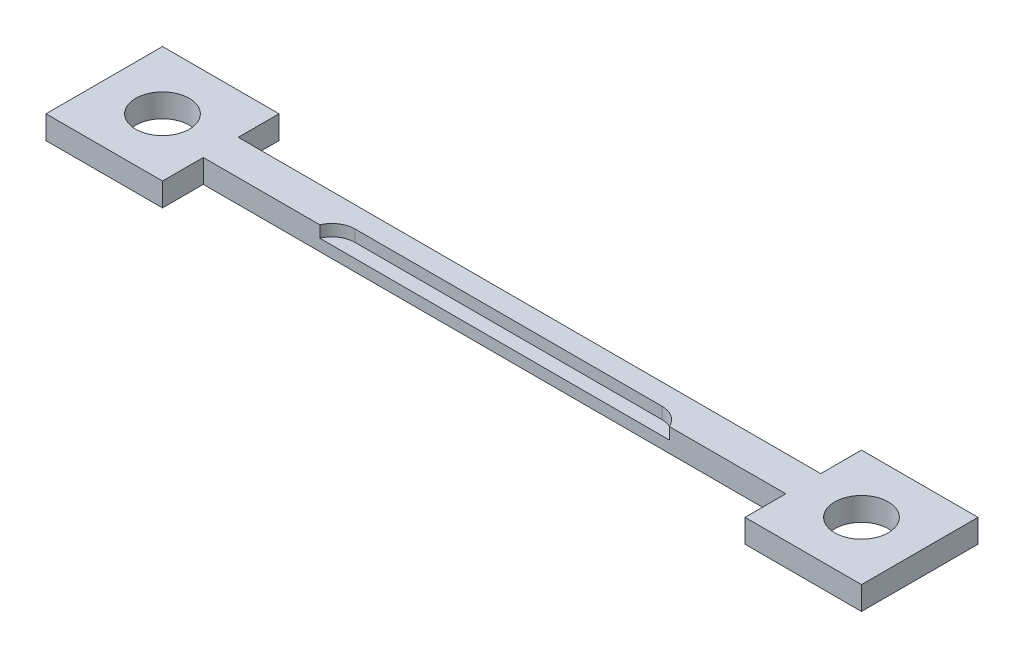
ISO-10303-21;
HEADER;
FILE_DESCRIPTION(('STEP AP214'),'2;1');
FILE_NAME('part.step','',(''),(''),'','','');
FILE_SCHEMA(('AUTOMOTIVE_DESIGN { 1 0 10303 214 1 1 1 1 }'));
ENDSEC;
DATA;
#1=APPLICATION_CONTEXT('core data for automotive mechanical design processes');
#2=APPLICATION_PROTOCOL_DEFINITION('international standard','automotive_design',2000,#1);
#3=PRODUCT_CONTEXT('',#1,'mechanical');
#4=PRODUCT('Part','Part','',(#3));
#5=PRODUCT_RELATED_PRODUCT_CATEGORY('part','',(#4));
#6=PRODUCT_DEFINITION_FORMATION('','',#4);
#7=PRODUCT_DEFINITION_CONTEXT('part definition',#1,'design');
#8=PRODUCT_DEFINITION('design','',#6,#7);
#9=PRODUCT_DEFINITION_SHAPE('','',#8);
#10=(LENGTH_UNIT() NAMED_UNIT(*) SI_UNIT(.MILLI.,.METRE.));
#11=(NAMED_UNIT(*) PLANE_ANGLE_UNIT() SI_UNIT($,.RADIAN.));
#12=(NAMED_UNIT(*) SI_UNIT($,.STERADIAN.) SOLID_ANGLE_UNIT());
#13=UNCERTAINTY_MEASURE_WITH_UNIT(LENGTH_MEASURE(1.E-05),#10,'distance_accuracy_value','');
#14=(GEOMETRIC_REPRESENTATION_CONTEXT(3) GLOBAL_UNCERTAINTY_ASSIGNED_CONTEXT((#13)) GLOBAL_UNIT_ASSIGNED_CONTEXT((#10,
#11,#12)) REPRESENTATION_CONTEXT('',''));
#15=CARTESIAN_POINT('',(0.,0.,0.));
#16=DIRECTION('',(0.,0.,1.));
#17=DIRECTION('',(1.,0.,0.));
#18=AXIS2_PLACEMENT_3D('',#15,#16,#17);
#19=CARTESIAN_POINT('',(-9.67404648456241,0.635,6.15575946530759));
#20=DIRECTION('',(0.,0.,1.));
#21=DIRECTION('',(1.,0.,0.));
#22=AXIS2_PLACEMENT_3D('',#19,#20,#21);
#23=PLANE('',#22);
#24=DIRECTION('',(-1.,0.,0.));
#25=VECTOR('',#24,1.);
#26=CARTESIAN_POINT('',(-9.67404648456241,-0.635,6.15575946530759));
#27=LINE('',#26,#25);
#28=CARTESIAN_POINT('',(-3.32404648456241,-0.635,6.15575946530759));
#29=VERTEX_POINT('',#28);
#30=CARTESIAN_POINT('',(-9.67404648456241,-0.635,6.15575946530759));
#31=VERTEX_POINT('',#30);
#32=EDGE_CURVE('E186',#29,#31,#27,.T.);
#33=ORIENTED_EDGE('',*,*,#32,.T.);
#34=DIRECTION('',(0.,-1.,0.));
#35=VECTOR('',#34,1.);
#36=CARTESIAN_POINT('',(-9.67404648456241,0.635,6.15575946530759));
#37=LINE('',#36,#35);
#38=CARTESIAN_POINT('',(-9.67404648456241,0.635,6.15575946530759));
#39=VERTEX_POINT('',#38);
#40=EDGE_CURVE('E270',#39,#31,#37,.T.);
#41=ORIENTED_EDGE('',*,*,#40,.F.);
#42=DIRECTION('',(-1.,0.,0.));
#43=VECTOR('',#42,1.);
#44=CARTESIAN_POINT('',(-9.67404648456241,0.635,6.15575946530759));
#45=LINE('',#44,#43);
#46=CARTESIAN_POINT('',(-3.32404648456241,0.635,6.15575946530759));
#47=VERTEX_POINT('',#46);
#48=EDGE_CURVE('E187',#47,#39,#45,.T.);
#49=ORIENTED_EDGE('',*,*,#48,.F.);
#50=DIRECTION('',(0.,-1.,0.));
#51=VECTOR('',#50,1.);
#52=CARTESIAN_POINT('',(-3.32404648456241,0.635,6.15575946530759));
#53=LINE('',#52,#51);
#54=EDGE_CURVE('E214',#47,#29,#53,.T.);
#55=ORIENTED_EDGE('',*,*,#54,.T.);
#56=EDGE_LOOP('',(#33,#41,#49,#55));
#57=FACE_BOUND('',#56,.T.);
#58=ADVANCED_FACE('F37',(#57),#23,.F.);
#59=CARTESIAN_POINT('',(-9.67404648456241,0.635,8.37825946530759));
#60=DIRECTION('',(1.,0.,0.));
#61=DIRECTION('',(0.,0.,-1.));
#62=AXIS2_PLACEMENT_3D('',#59,#60,#61);
#63=PLANE('',#62);
#64=DIRECTION('',(0.,0.,1.));
#65=VECTOR('',#64,1.);
#66=CARTESIAN_POINT('',(-9.67404648456241,-0.635,8.37825946530759));
#67=LINE('',#66,#65);
#68=CARTESIAN_POINT('',(-9.67404648456241,-0.635,8.37825946530759));
#69=VERTEX_POINT('',#68);
#70=EDGE_CURVE('E217',#31,#69,#67,.T.);
#71=ORIENTED_EDGE('',*,*,#70,.T.);
#72=DIRECTION('',(0.,-1.,0.));
#73=VECTOR('',#72,1.);
#74=CARTESIAN_POINT('',(-9.67404648456241,0.635,8.37825946530759));
#75=LINE('',#74,#73);
#76=CARTESIAN_POINT('',(-9.67404648456241,0.635,8.37825946530759));
#77=VERTEX_POINT('',#76);
#78=EDGE_CURVE('E267',#77,#69,#75,.T.);
#79=ORIENTED_EDGE('',*,*,#78,.F.);
#80=DIRECTION('',(0.,0.,1.));
#81=VECTOR('',#80,1.);
#82=CARTESIAN_POINT('',(-9.67404648456241,0.635,8.37825946530759));
#83=LINE('',#82,#81);
#84=EDGE_CURVE('E190',#39,#77,#83,.T.);
#85=ORIENTED_EDGE('',*,*,#84,.F.);
#86=ORIENTED_EDGE('',*,*,#40,.T.);
#87=EDGE_LOOP('',(#71,#79,#85,#86));
#88=FACE_BOUND('',#87,.T.);
#89=ADVANCED_FACE('F312',(#88),#63,.F.);
#90=CARTESIAN_POINT('',(-41.4240464845624,0.635,8.37825946530759));
#91=DIRECTION('',(0.,0.,1.));
#92=DIRECTION('',(1.,0.,0.));
#93=AXIS2_PLACEMENT_3D('',#90,#91,#92);
#94=PLANE('',#93);
#95=DIRECTION('',(-1.,0.,0.));
#96=VECTOR('',#95,1.);
#97=CARTESIAN_POINT('',(-41.4240464845624,-0.635,8.37825946530759));
#98=LINE('',#97,#96);
#99=CARTESIAN_POINT('',(-41.4240464845624,-0.635,8.37825946530759));
#100=VERTEX_POINT('',#99);
#101=EDGE_CURVE('E219',#69,#100,#98,.T.);
#102=ORIENTED_EDGE('',*,*,#101,.T.);
#103=DIRECTION('',(0.,-1.,0.));
#104=VECTOR('',#103,1.);
#105=CARTESIAN_POINT('',(-41.4240464845624,0.635,8.37825946530759));
#106=LINE('',#105,#104);
#107=CARTESIAN_POINT('',(-41.4240464845624,0.635,8.37825946530759));
#108=VERTEX_POINT('',#107);
#109=EDGE_CURVE('E264',#108,#100,#106,.T.);
#110=ORIENTED_EDGE('',*,*,#109,.F.);
#111=DIRECTION('',(-1.,0.,0.));
#112=VECTOR('',#111,1.);
#113=CARTESIAN_POINT('',(-41.4240464845624,0.635,8.37825946530759));
#114=LINE('',#113,#112);
#115=EDGE_CURVE('E193',#77,#108,#114,.T.);
#116=ORIENTED_EDGE('',*,*,#115,.F.);
#117=ORIENTED_EDGE('',*,*,#78,.T.);
#118=EDGE_LOOP('',(#102,#110,#116,#117));
#119=FACE_BOUND('',#118,.T.);
#120=ADVANCED_FACE('F318',(#119),#94,.F.);
#121=CARTESIAN_POINT('',(-41.4240464845624,0.635,8.37825946530759));
#122=DIRECTION('',(-1.,0.,0.));
#123=DIRECTION('',(0.,0.,1.));
#124=AXIS2_PLACEMENT_3D('',#121,#122,#123);
#125=PLANE('',#124);
#126=DIRECTION('',(0.,0.,-1.));
#127=VECTOR('',#126,1.);
#128=CARTESIAN_POINT('',(-41.4240464845624,-0.635,8.37825946530759));
#129=LINE('',#128,#127);
#130=CARTESIAN_POINT('',(-41.4240464845624,-0.635,6.15575946530758));
#131=VERTEX_POINT('',#130);
#132=EDGE_CURVE('E221',#100,#131,#129,.T.);
#133=ORIENTED_EDGE('',*,*,#132,.T.);
#134=DIRECTION('',(0.,-1.,0.));
#135=VECTOR('',#134,1.);
#136=CARTESIAN_POINT('',(-41.4240464845624,0.635,6.15575946530758));
#137=LINE('',#136,#135);
#138=CARTESIAN_POINT('',(-41.4240464845624,0.635,6.15575946530758));
#139=VERTEX_POINT('',#138);
#140=EDGE_CURVE('E261',#139,#131,#137,.T.);
#141=ORIENTED_EDGE('',*,*,#140,.F.);
#142=DIRECTION('',(0.,0.,-1.));
#143=VECTOR('',#142,1.);
#144=CARTESIAN_POINT('',(-41.4240464845624,0.635,8.37825946530759));
#145=LINE('',#144,#143);
#146=EDGE_CURVE('E195',#108,#139,#145,.T.);
#147=ORIENTED_EDGE('',*,*,#146,.F.);
#148=ORIENTED_EDGE('',*,*,#109,.T.);
#149=EDGE_LOOP('',(#133,#141,#147,#148));
#150=FACE_BOUND('',#149,.T.);
#151=ADVANCED_FACE('F324',(#150),#125,.F.);
#152=CARTESIAN_POINT('',(-47.7740464845624,0.635,6.15575946530758));
#153=DIRECTION('',(0.,0.,1.));
#154=DIRECTION('',(1.,0.,0.));
#155=AXIS2_PLACEMENT_3D('',#152,#153,#154);
#156=PLANE('',#155);
#157=DIRECTION('',(-1.,0.,0.));
#158=VECTOR('',#157,1.);
#159=CARTESIAN_POINT('',(-47.7740464845624,-0.635,6.15575946530758));
#160=LINE('',#159,#158);
#161=CARTESIAN_POINT('',(-47.7740464845624,-0.635,6.15575946530758));
#162=VERTEX_POINT('',#161);
#163=EDGE_CURVE('E223',#131,#162,#160,.T.);
#164=ORIENTED_EDGE('',*,*,#163,.T.);
#165=DIRECTION('',(0.,-1.,0.));
#166=VECTOR('',#165,1.);
#167=CARTESIAN_POINT('',(-47.7740464845624,0.635,6.15575946530758));
#168=LINE('',#167,#166);
#169=CARTESIAN_POINT('',(-47.7740464845624,0.635,6.15575946530758));
#170=VERTEX_POINT('',#169);
#171=EDGE_CURVE('E258',#170,#162,#168,.T.);
#172=ORIENTED_EDGE('',*,*,#171,.F.);
#173=DIRECTION('',(-1.,0.,0.));
#174=VECTOR('',#173,1.);
#175=CARTESIAN_POINT('',(-47.7740464845624,0.635,6.15575946530758));
#176=LINE('',#175,#174);
#177=EDGE_CURVE('E197',#139,#170,#176,.T.);
#178=ORIENTED_EDGE('',*,*,#177,.F.);
#179=ORIENTED_EDGE('',*,*,#140,.T.);
#180=EDGE_LOOP('',(#164,#172,#178,#179));
#181=FACE_BOUND('',#180,.T.);
#182=ADVANCED_FACE('F328',(#181),#156,.F.);
#183=CARTESIAN_POINT('',(-47.7740464845624,0.635,12.5057594653076));
#184=DIRECTION('',(1.,0.,0.));
#185=DIRECTION('',(0.,0.,-1.));
#186=AXIS2_PLACEMENT_3D('',#183,#184,#185);
#187=PLANE('',#186);
#188=DIRECTION('',(0.,0.,1.));
#189=VECTOR('',#188,1.);
#190=CARTESIAN_POINT('',(-47.7740464845624,-0.635,12.5057594653076));
#191=LINE('',#190,#189);
#192=CARTESIAN_POINT('',(-47.7740464845624,-0.635,12.5057594653076));
#193=VERTEX_POINT('',#192);
#194=EDGE_CURVE('E225',#162,#193,#191,.T.);
#195=ORIENTED_EDGE('',*,*,#194,.T.);
#196=DIRECTION('',(0.,-1.,0.));
#197=VECTOR('',#196,1.);
#198=CARTESIAN_POINT('',(-47.7740464845624,0.635,12.5057594653076));
#199=LINE('',#198,#197);
#200=CARTESIAN_POINT('',(-47.7740464845624,0.635,12.5057594653076));
#201=VERTEX_POINT('',#200);
#202=EDGE_CURVE('E255',#201,#193,#199,.T.);
#203=ORIENTED_EDGE('',*,*,#202,.F.);
#204=DIRECTION('',(0.,0.,1.));
#205=VECTOR('',#204,1.);
#206=CARTESIAN_POINT('',(-47.7740464845624,0.635,12.5057594653076));
#207=LINE('',#206,#205);
#208=EDGE_CURVE('E199',#170,#201,#207,.T.);
#209=ORIENTED_EDGE('',*,*,#208,.F.);
#210=ORIENTED_EDGE('',*,*,#171,.T.);
#211=EDGE_LOOP('',(#195,#203,#209,#210));
#212=FACE_BOUND('',#211,.T.);
#213=ADVANCED_FACE('F332',(#212),#187,.F.);
#214=CARTESIAN_POINT('',(-47.7740464845624,0.635,12.5057594653076));
#215=DIRECTION('',(0.,0.,-1.));
#216=DIRECTION('',(-1.,0.,0.));
#217=AXIS2_PLACEMENT_3D('',#214,#215,#216);
#218=PLANE('',#217);
#219=DIRECTION('',(1.,0.,0.));
#220=VECTOR('',#219,1.);
#221=CARTESIAN_POINT('',(-47.7740464845624,-0.635,12.5057594653076));
#222=LINE('',#221,#220);
#223=CARTESIAN_POINT('',(-41.4240464845624,-0.635,12.5057594653076));
#224=VERTEX_POINT('',#223);
#225=EDGE_CURVE('E227',#193,#224,#222,.T.);
#226=ORIENTED_EDGE('',*,*,#225,.T.);
#227=DIRECTION('',(0.,-1.,0.));
#228=VECTOR('',#227,1.);
#229=CARTESIAN_POINT('',(-41.4240464845624,0.635,12.5057594653076));
#230=LINE('',#229,#228);
#231=CARTESIAN_POINT('',(-41.4240464845624,0.635,12.5057594653076));
#232=VERTEX_POINT('',#231);
#233=EDGE_CURVE('E252',#232,#224,#230,.T.);
#234=ORIENTED_EDGE('',*,*,#233,.F.);
#235=DIRECTION('',(1.,0.,0.));
#236=VECTOR('',#235,1.);
#237=CARTESIAN_POINT('',(-47.7740464845624,0.635,12.5057594653076));
#238=LINE('',#237,#236);
#239=EDGE_CURVE('E201',#201,#232,#238,.T.);
#240=ORIENTED_EDGE('',*,*,#239,.F.);
#241=ORIENTED_EDGE('',*,*,#202,.T.);
#242=EDGE_LOOP('',(#226,#234,#240,#241));
#243=FACE_BOUND('',#242,.T.);
#244=ADVANCED_FACE('F336',(#243),#218,.F.);
#245=CARTESIAN_POINT('',(-41.4240464845624,0.635,10.2832594653076));
#246=DIRECTION('',(-1.,0.,0.));
#247=DIRECTION('',(0.,0.,1.));
#248=AXIS2_PLACEMENT_3D('',#245,#246,#247);
#249=PLANE('',#248);
#250=DIRECTION('',(0.,0.,-1.));
#251=VECTOR('',#250,1.);
#252=CARTESIAN_POINT('',(-41.4240464845624,-0.635,10.2832594653076));
#253=LINE('',#252,#251);
#254=CARTESIAN_POINT('',(-41.4240464845624,-0.635,10.2832594653076));
#255=VERTEX_POINT('',#254);
#256=EDGE_CURVE('E229',#224,#255,#253,.T.);
#257=ORIENTED_EDGE('',*,*,#256,.T.);
#258=DIRECTION('',(0.,-1.,0.));
#259=VECTOR('',#258,1.);
#260=CARTESIAN_POINT('',(-41.4240464845624,0.635,10.2832594653076));
#261=LINE('',#260,#259);
#262=CARTESIAN_POINT('',(-41.4240464845624,0.635,10.2832594653076));
#263=VERTEX_POINT('',#262);
#264=EDGE_CURVE('E249',#263,#255,#261,.T.);
#265=ORIENTED_EDGE('',*,*,#264,.F.);
#266=DIRECTION('',(0.,0.,-1.));
#267=VECTOR('',#266,1.);
#268=CARTESIAN_POINT('',(-41.4240464845624,0.635,10.2832594653076));
#269=LINE('',#268,#267);
#270=EDGE_CURVE('E203',#232,#263,#269,.T.);
#271=ORIENTED_EDGE('',*,*,#270,.F.);
#272=ORIENTED_EDGE('',*,*,#233,.T.);
#273=EDGE_LOOP('',(#257,#265,#271,#272));
#274=FACE_BOUND('',#273,.T.);
#275=ADVANCED_FACE('F340',(#274),#249,.F.);
#276=CARTESIAN_POINT('',(-41.4240464845624,0.635,10.2832594653076));
#277=DIRECTION('',(0.,0.,-1.));
#278=DIRECTION('',(-1.,0.,0.));
#279=AXIS2_PLACEMENT_3D('',#276,#277,#278);
#280=PLANE('',#279);
#281=DIRECTION('',(1.,0.,0.));
#282=VECTOR('',#281,1.);
#283=CARTESIAN_POINT('',(-41.4240464845624,0.635,10.2832594653076));
#284=LINE('',#283,#282);
#285=CARTESIAN_POINT('',(-16.0240464845624,0.635,10.2832594653076));
#286=VERTEX_POINT('',#285);
#287=CARTESIAN_POINT('',(-9.67404648456241,0.635,10.2832594653076));
#288=VERTEX_POINT('',#287);
#289=EDGE_CURVE('E205',#286,#288,#284,.T.);
#290=ORIENTED_EDGE('',*,*,#289,.F.);
#291=DIRECTION('',(0.,1.,0.));
#292=VECTOR('',#291,1.);
#293=CARTESIAN_POINT('',(-16.0240464845624,0.,10.2832594653076));
#294=LINE('',#293,#292);
#295=CARTESIAN_POINT('',(-16.0240464845624,0.,10.2832594653076));
#296=VERTEX_POINT('',#295);
#297=EDGE_CURVE('E166',#296,#286,#294,.T.);
#298=ORIENTED_EDGE('',*,*,#297,.F.);
#299=DIRECTION('',(1.,0.,0.));
#300=VECTOR('',#299,1.);
#301=CARTESIAN_POINT('',(-35.0740464845624,0.,10.2832594653076));
#302=LINE('',#301,#300);
#303=CARTESIAN_POINT('',(-35.0740464845624,0.,10.2832594653076));
#304=VERTEX_POINT('',#303);
#305=EDGE_CURVE('E149',#304,#296,#302,.T.);
#306=ORIENTED_EDGE('',*,*,#305,.F.);
#307=DIRECTION('',(0.,1.,0.));
#308=VECTOR('',#307,1.);
#309=CARTESIAN_POINT('',(-35.0740464845624,0.,10.2832594653076));
#310=LINE('',#309,#308);
#311=CARTESIAN_POINT('',(-35.0740464845624,0.635,10.2832594653076));
#312=VERTEX_POINT('',#311);
#313=EDGE_CURVE('E164',#304,#312,#310,.T.);
#314=ORIENTED_EDGE('',*,*,#313,.T.);
#315=EDGE_CURVE('E206',#263,#312,#284,.T.);
#316=ORIENTED_EDGE('',*,*,#315,.F.);
#317=ORIENTED_EDGE('',*,*,#264,.T.);
#318=DIRECTION('',(1.,0.,0.));
#319=VECTOR('',#318,1.);
#320=CARTESIAN_POINT('',(-41.4240464845624,-0.635,10.2832594653076));
#321=LINE('',#320,#319);
#322=CARTESIAN_POINT('',(-9.67404648456241,-0.635,10.2832594653076));
#323=VERTEX_POINT('',#322);
#324=EDGE_CURVE('E231',#255,#323,#321,.T.);
#325=ORIENTED_EDGE('',*,*,#324,.T.);
#326=DIRECTION('',(0.,-1.,0.));
#327=VECTOR('',#326,1.);
#328=CARTESIAN_POINT('',(-9.67404648456241,0.635,10.2832594653076));
#329=LINE('',#328,#327);
#330=EDGE_CURVE('E246',#288,#323,#329,.T.);
#331=ORIENTED_EDGE('',*,*,#330,.F.);
#332=EDGE_LOOP('',(#290,#298,#306,#314,#316,#317,#325,#331));
#333=FACE_BOUND('',#332,.T.);
#334=ADVANCED_FACE('F162',(#333),#280,.F.);
#335=CARTESIAN_POINT('',(-9.67404648456241,0.635,10.2832594653076));
#336=DIRECTION('',(1.,0.,0.));
#337=DIRECTION('',(0.,0.,-1.));
#338=AXIS2_PLACEMENT_3D('',#335,#336,#337);
#339=PLANE('',#338);
#340=DIRECTION('',(0.,0.,1.));
#341=VECTOR('',#340,1.);
#342=CARTESIAN_POINT('',(-9.67404648456241,-0.635,10.2832594653076));
#343=LINE('',#342,#341);
#344=CARTESIAN_POINT('',(-9.67404648456241,-0.635,12.5057594653076));
#345=VERTEX_POINT('',#344);
#346=EDGE_CURVE('E233',#323,#345,#343,.T.);
#347=ORIENTED_EDGE('',*,*,#346,.T.);
#348=DIRECTION('',(0.,-1.,0.));
#349=VECTOR('',#348,1.);
#350=CARTESIAN_POINT('',(-9.67404648456241,0.635,12.5057594653076));
#351=LINE('',#350,#349);
#352=CARTESIAN_POINT('',(-9.67404648456241,0.635,12.5057594653076));
#353=VERTEX_POINT('',#352);
#354=EDGE_CURVE('E243',#353,#345,#351,.T.);
#355=ORIENTED_EDGE('',*,*,#354,.F.);
#356=DIRECTION('',(0.,0.,1.));
#357=VECTOR('',#356,1.);
#358=CARTESIAN_POINT('',(-9.67404648456241,0.635,10.2832594653076));
#359=LINE('',#358,#357);
#360=EDGE_CURVE('E208',#288,#353,#359,.T.);
#361=ORIENTED_EDGE('',*,*,#360,.F.);
#362=ORIENTED_EDGE('',*,*,#330,.T.);
#363=EDGE_LOOP('',(#347,#355,#361,#362));
#364=FACE_BOUND('',#363,.T.);
#365=ADVANCED_FACE('F299',(#364),#339,.F.);
#366=CARTESIAN_POINT('',(-9.67404648456241,0.635,12.5057594653076));
#367=DIRECTION('',(0.,0.,-1.));
#368=DIRECTION('',(-1.,0.,0.));
#369=AXIS2_PLACEMENT_3D('',#366,#367,#368);
#370=PLANE('',#369);
#371=DIRECTION('',(1.,0.,0.));
#372=VECTOR('',#371,1.);
#373=CARTESIAN_POINT('',(-9.67404648456241,-0.635,12.5057594653076));
#374=LINE('',#373,#372);
#375=CARTESIAN_POINT('',(-3.32404648456241,-0.635,12.5057594653076));
#376=VERTEX_POINT('',#375);
#377=EDGE_CURVE('E235',#345,#376,#374,.T.);
#378=ORIENTED_EDGE('',*,*,#377,.T.);
#379=DIRECTION('',(0.,-1.,0.));
#380=VECTOR('',#379,1.);
#381=CARTESIAN_POINT('',(-3.32404648456241,0.635,12.5057594653076));
#382=LINE('',#381,#380);
#383=CARTESIAN_POINT('',(-3.32404648456241,0.635,12.5057594653076));
#384=VERTEX_POINT('',#383);
#385=EDGE_CURVE('E240',#384,#376,#382,.T.);
#386=ORIENTED_EDGE('',*,*,#385,.F.);
#387=DIRECTION('',(1.,0.,0.));
#388=VECTOR('',#387,1.);
#389=CARTESIAN_POINT('',(-9.67404648456241,0.635,12.5057594653076));
#390=LINE('',#389,#388);
#391=EDGE_CURVE('E210',#353,#384,#390,.T.);
#392=ORIENTED_EDGE('',*,*,#391,.F.);
#393=ORIENTED_EDGE('',*,*,#354,.T.);
#394=EDGE_LOOP('',(#378,#386,#392,#393));
#395=FACE_BOUND('',#394,.T.);
#396=ADVANCED_FACE('F303',(#395),#370,.F.);
#397=CARTESIAN_POINT('',(-3.32404648456241,0.635,12.5057594653076));
#398=DIRECTION('',(-1.,0.,0.));
#399=DIRECTION('',(0.,0.,1.));
#400=AXIS2_PLACEMENT_3D('',#397,#398,#399);
#401=PLANE('',#400);
#402=DIRECTION('',(0.,0.,-1.));
#403=VECTOR('',#402,1.);
#404=CARTESIAN_POINT('',(-3.32404648456241,-0.635,12.5057594653076));
#405=LINE('',#404,#403);
#406=EDGE_CURVE('E191',#376,#29,#405,.T.);
#407=ORIENTED_EDGE('',*,*,#406,.T.);
#408=ORIENTED_EDGE('',*,*,#54,.F.);
#409=DIRECTION('',(0.,0.,-1.));
#410=VECTOR('',#409,1.);
#411=CARTESIAN_POINT('',(-3.32404648456241,0.635,12.5057594653076));
#412=LINE('',#411,#410);
#413=EDGE_CURVE('E212',#384,#47,#412,.T.);
#414=ORIENTED_EDGE('',*,*,#413,.F.);
#415=ORIENTED_EDGE('',*,*,#385,.T.);
#416=EDGE_LOOP('',(#407,#408,#414,#415));
#417=FACE_BOUND('',#416,.T.);
#418=ADVANCED_FACE('F350',(#417),#401,.F.);
#419=CARTESIAN_POINT('',(-3.32404648456241,0.635,6.15575946530759));
#420=DIRECTION('',(0.,1.,0.));
#421=DIRECTION('',(0.,0.,1.));
#422=AXIS2_PLACEMENT_3D('',#419,#420,#421);
#423=PLANE('',#422);
#424=DIRECTION('',(-1.,0.,0.));
#425=VECTOR('',#424,1.);
#426=CARTESIAN_POINT('',(-35.0740464845624,0.635,9.52125946530759));
#427=LINE('',#426,#425);
#428=CARTESIAN_POINT('',(-17.1880207110812,0.635,9.52125946530759));
#429=VERTEX_POINT('',#428);
#430=CARTESIAN_POINT('',(-33.9100722580436,0.635,9.52125946530759));
#431=VERTEX_POINT('',#430);
#432=EDGE_CURVE('E279',#429,#431,#427,.T.);
#433=ORIENTED_EDGE('',*,*,#432,.F.);
#434=CARTESIAN_POINT('',(-17.1880207110812,0.635,10.7912594653076));
#435=DIRECTION('',(0.,1.,0.));
#436=DIRECTION('',(0.,0.,1.));
#437=AXIS2_PLACEMENT_3D('',#434,#435,#436);
#438=CIRCLE('',#437,1.27);
#439=EDGE_CURVE('E11',#429,#286,#438,.F.);
#440=ORIENTED_EDGE('',*,*,#439,.T.);
#441=ORIENTED_EDGE('',*,*,#289,.T.);
#442=ORIENTED_EDGE('',*,*,#360,.T.);
#443=ORIENTED_EDGE('',*,*,#391,.T.);
#444=ORIENTED_EDGE('',*,*,#413,.T.);
#445=ORIENTED_EDGE('',*,*,#48,.T.);
#446=ORIENTED_EDGE('',*,*,#84,.T.);
#447=ORIENTED_EDGE('',*,*,#115,.T.);
#448=ORIENTED_EDGE('',*,*,#146,.T.);
#449=ORIENTED_EDGE('',*,*,#177,.T.);
#450=ORIENTED_EDGE('',*,*,#208,.T.);
#451=ORIENTED_EDGE('',*,*,#239,.T.);
#452=ORIENTED_EDGE('',*,*,#270,.T.);
#453=ORIENTED_EDGE('',*,*,#315,.T.);
#454=CARTESIAN_POINT('',(-33.9100722580436,0.635,10.7912594653076));
#455=DIRECTION('',(0.,1.,0.));
#456=DIRECTION('',(0.,0.,1.));
#457=AXIS2_PLACEMENT_3D('',#454,#455,#456);
#458=CIRCLE('',#457,1.27);
#459=EDGE_CURVE('E156',#312,#431,#458,.F.);
#460=ORIENTED_EDGE('',*,*,#459,.T.);
#461=EDGE_LOOP('',(#433,#440,#441,#442,#443,#444,#445,#446,#447,#448,#449,#450,#451,#452,#453,#460));
#462=FACE_BOUND('',#461,.T.);
#463=CARTESIAN_POINT('',(-6.49904648456241,0.635,9.33075946530758));
#464=DIRECTION('',(0.,1.,0.));
#465=DIRECTION('',(0.,0.,1.));
#466=AXIS2_PLACEMENT_3D('',#463,#464,#465);
#467=CIRCLE('',#466,1.4605);
#468=CARTESIAN_POINT('',(-6.49904648456241,0.635,10.7912594653076));
#469=VERTEX_POINT('',#468);
#470=EDGE_CURVE('E171',#469,#469,#467,.T.);
#471=ORIENTED_EDGE('',*,*,#470,.F.);
#472=EDGE_LOOP('',(#471));
#473=FACE_BOUND('',#472,.T.);
#474=CARTESIAN_POINT('',(-44.5990464845624,0.635,9.33075946530758));
#475=DIRECTION('',(0.,1.,0.));
#476=DIRECTION('',(0.,0.,1.));
#477=AXIS2_PLACEMENT_3D('',#474,#475,#476);
#478=CIRCLE('',#477,1.4605);
#479=CARTESIAN_POINT('',(-44.5990464845624,0.635,10.7912594653076));
#480=VERTEX_POINT('',#479);
#481=EDGE_CURVE('E180',#480,#480,#478,.T.);
#482=ORIENTED_EDGE('',*,*,#481,.F.);
#483=EDGE_LOOP('',(#482));
#484=FACE_BOUND('',#483,.T.);
#485=ADVANCED_FACE('F281',(#462,#473,#484),#423,.T.);
#486=CARTESIAN_POINT('',(-3.32404648456241,-0.635,6.15575946530759));
#487=DIRECTION('',(0.,1.,0.));
#488=DIRECTION('',(0.,0.,1.));
#489=AXIS2_PLACEMENT_3D('',#486,#487,#488);
#490=PLANE('',#489);
#491=CARTESIAN_POINT('',(-6.49904648456241,-0.635,9.33075946530758));
#492=DIRECTION('',(0.,1.,0.));
#493=DIRECTION('',(0.,0.,1.));
#494=AXIS2_PLACEMENT_3D('',#491,#492,#493);
#495=CIRCLE('',#494,1.4605);
#496=CARTESIAN_POINT('',(-6.49904648456241,-0.635,10.7912594653076));
#497=VERTEX_POINT('',#496);
#498=EDGE_CURVE('E177',#497,#497,#495,.T.);
#499=ORIENTED_EDGE('',*,*,#498,.T.);
#500=EDGE_LOOP('',(#499));
#501=FACE_BOUND('',#500,.T.);
#502=CARTESIAN_POINT('',(-44.5990464845624,-0.635,9.33075946530758));
#503=DIRECTION('',(0.,1.,0.));
#504=DIRECTION('',(0.,0.,1.));
#505=AXIS2_PLACEMENT_3D('',#502,#503,#504);
#506=CIRCLE('',#505,1.4605);
#507=CARTESIAN_POINT('',(-44.5990464845624,-0.635,10.7912594653076));
#508=VERTEX_POINT('',#507);
#509=EDGE_CURVE('E183',#508,#508,#506,.T.);
#510=ORIENTED_EDGE('',*,*,#509,.T.);
#511=EDGE_LOOP('',(#510));
#512=FACE_BOUND('',#511,.T.);
#513=ORIENTED_EDGE('',*,*,#32,.F.);
#514=ORIENTED_EDGE('',*,*,#406,.F.);
#515=ORIENTED_EDGE('',*,*,#377,.F.);
#516=ORIENTED_EDGE('',*,*,#346,.F.);
#517=ORIENTED_EDGE('',*,*,#324,.F.);
#518=ORIENTED_EDGE('',*,*,#256,.F.);
#519=ORIENTED_EDGE('',*,*,#225,.F.);
#520=ORIENTED_EDGE('',*,*,#194,.F.);
#521=ORIENTED_EDGE('',*,*,#163,.F.);
#522=ORIENTED_EDGE('',*,*,#132,.F.);
#523=ORIENTED_EDGE('',*,*,#101,.F.);
#524=ORIENTED_EDGE('',*,*,#70,.F.);
#525=EDGE_LOOP('',(#513,#514,#515,#516,#517,#518,#519,#520,#521,#522,#523,#524));
#526=FACE_BOUND('',#525,.T.);
#527=ADVANCED_FACE('F293',(#501,#512,#526),#490,.F.);
#528=CARTESIAN_POINT('',(-44.5990464845624,0.635,9.33075946530758));
#529=DIRECTION('',(0.,1.,0.));
#530=DIRECTION('',(0.,0.,1.));
#531=AXIS2_PLACEMENT_3D('',#528,#529,#530);
#532=CYLINDRICAL_SURFACE('',#531,1.4605);
#533=ORIENTED_EDGE('',*,*,#509,.F.);
#534=EDGE_LOOP('',(#533));
#535=FACE_BOUND('',#534,.T.);
#536=ORIENTED_EDGE('',*,*,#481,.T.);
#537=EDGE_LOOP('',(#536));
#538=FACE_BOUND('',#537,.T.);
#539=ADVANCED_FACE('F356',(#535,#538),#532,.F.);
#540=CARTESIAN_POINT('',(-6.49904648456241,0.635,9.33075946530758));
#541=DIRECTION('',(0.,1.,0.));
#542=DIRECTION('',(0.,0.,1.));
#543=AXIS2_PLACEMENT_3D('',#540,#541,#542);
#544=CYLINDRICAL_SURFACE('',#543,1.4605);
#545=ORIENTED_EDGE('',*,*,#498,.F.);
#546=EDGE_LOOP('',(#545));
#547=FACE_BOUND('',#546,.T.);
#548=ORIENTED_EDGE('',*,*,#470,.T.);
#549=EDGE_LOOP('',(#548));
#550=FACE_BOUND('',#549,.T.);
#551=ADVANCED_FACE('F362',(#547,#550),#544,.F.);
#552=CARTESIAN_POINT('',(-35.0740464845624,0.,9.52125946530759));
#553=DIRECTION('',(0.,0.,-1.));
#554=DIRECTION('',(-1.,0.,0.));
#555=AXIS2_PLACEMENT_3D('',#552,#553,#554);
#556=PLANE('',#555);
#557=DIRECTION('',(-1.,0.,0.));
#558=VECTOR('',#557,1.);
#559=CARTESIAN_POINT('',(-35.0740464845624,0.,9.52125946530759));
#560=LINE('',#559,#558);
#561=CARTESIAN_POINT('',(-17.1880207110812,0.,9.52125946530759));
#562=VERTEX_POINT('',#561);
#563=CARTESIAN_POINT('',(-33.9100722580436,0.,9.52125946530759));
#564=VERTEX_POINT('',#563);
#565=EDGE_CURVE('E151',#562,#564,#560,.T.);
#566=ORIENTED_EDGE('',*,*,#565,.F.);
#567=DIRECTION('',(0.,1.,0.));
#568=VECTOR('',#567,1.);
#569=CARTESIAN_POINT('',(-17.1880207110812,0.,9.52125946530759));
#570=LINE('',#569,#568);
#571=EDGE_CURVE('E275',#562,#429,#570,.T.);
#572=ORIENTED_EDGE('',*,*,#571,.T.);
#573=ORIENTED_EDGE('',*,*,#432,.T.);
#574=DIRECTION('',(0.,-1.,0.));
#575=VECTOR('',#574,1.);
#576=CARTESIAN_POINT('',(-33.9100722580436,0.,9.52125946530759));
#577=LINE('',#576,#575);
#578=EDGE_CURVE('E157',#431,#564,#577,.T.);
#579=ORIENTED_EDGE('',*,*,#578,.T.);
#580=EDGE_LOOP('',(#566,#572,#573,#579));
#581=FACE_BOUND('',#580,.T.);
#582=ADVANCED_FACE('F278',(#581),#556,.F.);
#583=CARTESIAN_POINT('',(0.,0.,0.));
#584=DIRECTION('',(0.,1.,0.));
#585=DIRECTION('',(0.,0.,1.));
#586=AXIS2_PLACEMENT_3D('',#583,#584,#585);
#587=PLANE('',#586);
#588=ORIENTED_EDGE('',*,*,#305,.T.);
#589=CARTESIAN_POINT('',(-17.1880207110812,0.,10.7912594653076));
#590=DIRECTION('',(0.,1.,0.));
#591=DIRECTION('',(0.,0.,1.));
#592=AXIS2_PLACEMENT_3D('',#589,#590,#591);
#593=CIRCLE('',#592,1.27);
#594=EDGE_CURVE('E45',#296,#562,#593,.T.);
#595=ORIENTED_EDGE('',*,*,#594,.T.);
#596=ORIENTED_EDGE('',*,*,#565,.T.);
#597=CARTESIAN_POINT('',(-33.9100722580436,0.,10.7912594653076));
#598=DIRECTION('',(0.,1.,0.));
#599=DIRECTION('',(0.,0.,1.));
#600=AXIS2_PLACEMENT_3D('',#597,#598,#599);
#601=CIRCLE('',#600,1.27);
#602=EDGE_CURVE('E146',#564,#304,#601,.T.);
#603=ORIENTED_EDGE('',*,*,#602,.T.);
#604=EDGE_LOOP('',(#588,#595,#596,#603));
#605=FACE_BOUND('',#604,.T.);
#606=ADVANCED_FACE('F148',(#605),#587,.T.);
#607=CARTESIAN_POINT('',(-33.9100722580436,0.,10.7912594653076));
#608=DIRECTION('',(0.,-1.,0.));
#609=DIRECTION('',(0.,0.,-1.));
#610=AXIS2_PLACEMENT_3D('',#607,#608,#609);
#611=CYLINDRICAL_SURFACE('',#610,1.27);
#612=ORIENTED_EDGE('',*,*,#602,.F.);
#613=ORIENTED_EDGE('',*,*,#578,.F.);
#614=ORIENTED_EDGE('',*,*,#459,.F.);
#615=ORIENTED_EDGE('',*,*,#313,.F.);
#616=EDGE_LOOP('',(#612,#613,#614,#615));
#617=FACE_BOUND('',#616,.T.);
#618=ADVANCED_FACE('F168',(#617),#611,.F.);
#619=CARTESIAN_POINT('',(-17.1880207110812,0.,10.7912594653076));
#620=DIRECTION('',(0.,1.,0.));
#621=DIRECTION('',(0.,0.,1.));
#622=AXIS2_PLACEMENT_3D('',#619,#620,#621);
#623=CYLINDRICAL_SURFACE('',#622,1.27);
#624=ORIENTED_EDGE('',*,*,#594,.F.);
#625=ORIENTED_EDGE('',*,*,#297,.T.);
#626=ORIENTED_EDGE('',*,*,#439,.F.);
#627=ORIENTED_EDGE('',*,*,#571,.F.);
#628=EDGE_LOOP('',(#624,#625,#626,#627));
#629=FACE_BOUND('',#628,.T.);
#630=ADVANCED_FACE('F39',(#629),#623,.F.);
#631=CLOSED_SHELL('',(#58,#89,#120,#151,#182,#213,#244,#275,#334,#365,#396,#418,#485,#527,#539,
#551,#582,#606,#618,#630));
#632=MANIFOLD_SOLID_BREP('B2',#631);
#633=ADVANCED_BREP_SHAPE_REPRESENTATION('',(#18,#632),#14);
#634=SHAPE_DEFINITION_REPRESENTATION(#9,#633);
ENDSEC;
END-ISO-10303-21;
